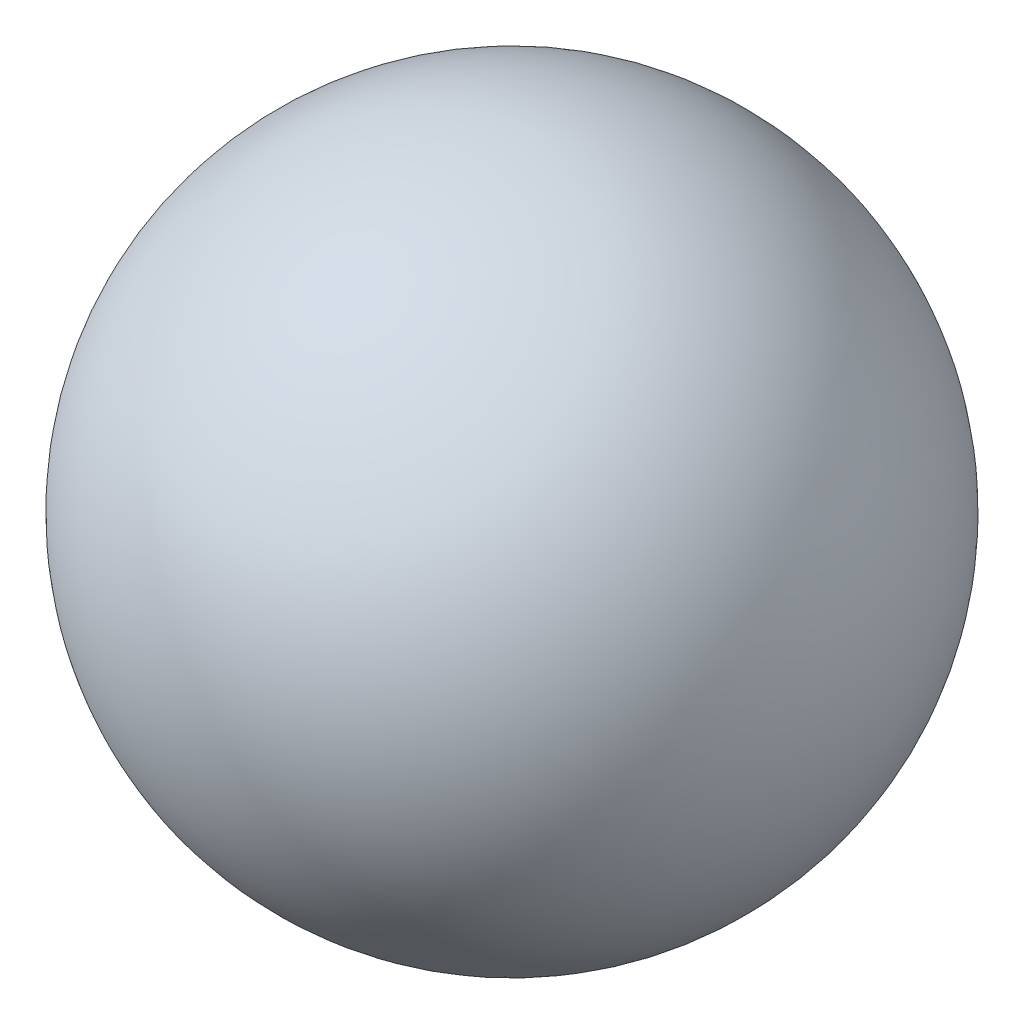
ISO-10303-21;
HEADER;
FILE_DESCRIPTION(('STEP AP214'),'2;1');
FILE_NAME('part.step','',(''),(''),'','','');
FILE_SCHEMA(('AUTOMOTIVE_DESIGN { 1 0 10303 214 1 1 1 1 }'));
ENDSEC;
DATA;
#1=APPLICATION_CONTEXT('core data for automotive mechanical design processes');
#2=APPLICATION_PROTOCOL_DEFINITION('international standard','automotive_design',2000,#1);
#3=PRODUCT_CONTEXT('',#1,'mechanical');
#4=PRODUCT('Part','Part','',(#3));
#5=PRODUCT_RELATED_PRODUCT_CATEGORY('part','',(#4));
#6=PRODUCT_DEFINITION_FORMATION('','',#4);
#7=PRODUCT_DEFINITION_CONTEXT('part definition',#1,'design');
#8=PRODUCT_DEFINITION('design','',#6,#7);
#9=PRODUCT_DEFINITION_SHAPE('','',#8);
#10=(LENGTH_UNIT() NAMED_UNIT(*) SI_UNIT(.MILLI.,.METRE.));
#11=(NAMED_UNIT(*) PLANE_ANGLE_UNIT() SI_UNIT($,.RADIAN.));
#12=(NAMED_UNIT(*) SI_UNIT($,.STERADIAN.) SOLID_ANGLE_UNIT());
#13=UNCERTAINTY_MEASURE_WITH_UNIT(LENGTH_MEASURE(1.E-05),#10,'distance_accuracy_value','');
#14=(GEOMETRIC_REPRESENTATION_CONTEXT(3) GLOBAL_UNCERTAINTY_ASSIGNED_CONTEXT((#13)) GLOBAL_UNIT_ASSIGNED_CONTEXT((#10,
#11,#12)) REPRESENTATION_CONTEXT('',''));
#15=CARTESIAN_POINT('',(0.,0.,0.));
#16=DIRECTION('',(0.,0.,1.));
#17=DIRECTION('',(1.,0.,0.));
#18=AXIS2_PLACEMENT_3D('',#15,#16,#17);
#19=CARTESIAN_POINT('',(0.,0.,0.));
#20=DIRECTION('',(0.,0.,-1.));
#21=DIRECTION('',(1.,0.,0.));
#22=AXIS2_PLACEMENT_3D('',#19,#20,#21);
#23=SPHERICAL_SURFACE('',#22,110.);
#24=CARTESIAN_POINT('',(0.,0.,-110.));
#25=VERTEX_POINT('',#24);
#26=VERTEX_LOOP('',#25);
#27=FACE_BOUND('',#26,.T.);
#28=ADVANCED_FACE('F33',(#27),#23,.T.);
#29=CLOSED_SHELL('',(#28));
#30=MANIFOLD_SOLID_BREP('B2',#29);
#31=ADVANCED_BREP_SHAPE_REPRESENTATION('',(#18,#30),#14);
#32=SHAPE_DEFINITION_REPRESENTATION(#9,#31);
ENDSEC;
END-ISO-10303-21;
